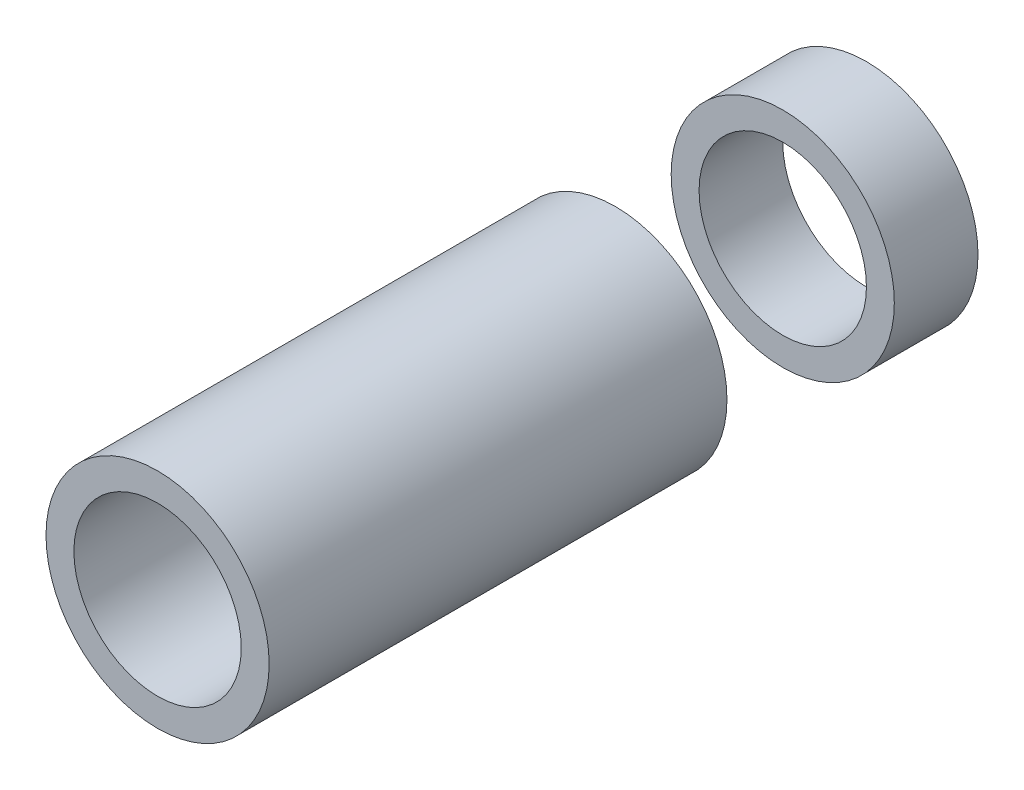
ISO-10303-21;
HEADER;
FILE_DESCRIPTION(('STEP AP214'),'2;1');
FILE_NAME('part.step','',(''),(''),'','','');
FILE_SCHEMA(('AUTOMOTIVE_DESIGN { 1 0 10303 214 1 1 1 1 }'));
ENDSEC;
DATA;
#1=APPLICATION_CONTEXT('core data for automotive mechanical design processes');
#2=APPLICATION_PROTOCOL_DEFINITION('international standard','automotive_design',2000,#1);
#3=PRODUCT_CONTEXT('',#1,'mechanical');
#4=PRODUCT('Part','Part','',(#3));
#5=PRODUCT_RELATED_PRODUCT_CATEGORY('part','',(#4));
#6=PRODUCT_DEFINITION_FORMATION('','',#4);
#7=PRODUCT_DEFINITION_CONTEXT('part definition',#1,'design');
#8=PRODUCT_DEFINITION('design','',#6,#7);
#9=PRODUCT_DEFINITION_SHAPE('','',#8);
#10=(LENGTH_UNIT() NAMED_UNIT(*) SI_UNIT(.MILLI.,.METRE.));
#11=(NAMED_UNIT(*) PLANE_ANGLE_UNIT() SI_UNIT($,.RADIAN.));
#12=(NAMED_UNIT(*) SI_UNIT($,.STERADIAN.) SOLID_ANGLE_UNIT());
#13=UNCERTAINTY_MEASURE_WITH_UNIT(LENGTH_MEASURE(1.E-05),#10,'distance_accuracy_value','');
#14=(GEOMETRIC_REPRESENTATION_CONTEXT(3) GLOBAL_UNCERTAINTY_ASSIGNED_CONTEXT((#13)) GLOBAL_UNIT_ASSIGNED_CONTEXT((#10,
#11,#12)) REPRESENTATION_CONTEXT('',''));
#15=CARTESIAN_POINT('',(0.,0.,0.));
#16=DIRECTION('',(0.,0.,1.));
#17=DIRECTION('',(1.,0.,0.));
#18=AXIS2_PLACEMENT_3D('',#15,#16,#17);
#19=CARTESIAN_POINT('',(0.,6.,-44.82608696));
#20=DIRECTION('',(0.,0.,1.));
#21=DIRECTION('',(1.,0.,0.));
#22=AXIS2_PLACEMENT_3D('',#19,#20,#21);
#23=PLANE('',#22);
#24=CARTESIAN_POINT('',(0.,0.,-44.82608696));
#25=DIRECTION('',(0.,0.,-1.));
#26=DIRECTION('',(-1.,0.,0.));
#27=AXIS2_PLACEMENT_3D('',#24,#25,#26);
#28=CIRCLE('',#27,6.);
#29=CARTESIAN_POINT('',(-6.,0.,-44.82608696));
#30=VERTEX_POINT('',#29);
#31=EDGE_CURVE('E53',#30,#30,#28,.T.);
#32=ORIENTED_EDGE('',*,*,#31,.T.);
#33=EDGE_LOOP('',(#32));
#34=FACE_BOUND('',#33,.T.);
#35=CARTESIAN_POINT('',(0.,0.,-44.82608696));
#36=DIRECTION('',(0.,0.,-1.));
#37=DIRECTION('',(-1.,0.,0.));
#38=AXIS2_PLACEMENT_3D('',#35,#36,#37);
#39=CIRCLE('',#38,8.);
#40=CARTESIAN_POINT('',(-8.,0.,-44.82608696));
#41=VERTEX_POINT('',#40);
#42=EDGE_CURVE('E11',#41,#41,#39,.T.);
#43=ORIENTED_EDGE('',*,*,#42,.F.);
#44=EDGE_LOOP('',(#43));
#45=FACE_BOUND('',#44,.T.);
#46=ADVANCED_FACE('F39',(#34,#45),#23,.T.);
#47=CARTESIAN_POINT('',(0.,0.,-26.3478260869565));
#48=DIRECTION('',(0.,0.,-1.));
#49=DIRECTION('',(-1.,0.,0.));
#50=AXIS2_PLACEMENT_3D('',#47,#48,#49);
#51=CYLINDRICAL_SURFACE('',#50,8.);
#52=ORIENTED_EDGE('',*,*,#42,.T.);
#53=EDGE_LOOP('',(#52));
#54=FACE_BOUND('',#53,.T.);
#55=CARTESIAN_POINT('',(0.,0.,-50.82608696));
#56=DIRECTION('',(0.,0.,-1.));
#57=DIRECTION('',(-1.,0.,0.));
#58=AXIS2_PLACEMENT_3D('',#55,#56,#57);
#59=CIRCLE('',#58,8.);
#60=CARTESIAN_POINT('',(-8.,0.,-50.82608696));
#61=VERTEX_POINT('',#60);
#62=EDGE_CURVE('E45',#61,#61,#59,.T.);
#63=ORIENTED_EDGE('',*,*,#62,.F.);
#64=EDGE_LOOP('',(#63));
#65=FACE_BOUND('',#64,.T.);
#66=ADVANCED_FACE('F69',(#54,#65),#51,.T.);
#67=CARTESIAN_POINT('',(0.,8.,-50.82608696));
#68=DIRECTION('',(0.,0.,-1.));
#69=DIRECTION('',(-1.,0.,0.));
#70=AXIS2_PLACEMENT_3D('',#67,#68,#69);
#71=PLANE('',#70);
#72=ORIENTED_EDGE('',*,*,#62,.T.);
#73=EDGE_LOOP('',(#72));
#74=FACE_BOUND('',#73,.T.);
#75=CARTESIAN_POINT('',(0.,0.,-50.82608696));
#76=DIRECTION('',(0.,0.,-1.));
#77=DIRECTION('',(-1.,0.,0.));
#78=AXIS2_PLACEMENT_3D('',#75,#76,#77);
#79=CIRCLE('',#78,6.);
#80=CARTESIAN_POINT('',(-6.,0.,-50.82608696));
#81=VERTEX_POINT('',#80);
#82=EDGE_CURVE('E49',#81,#81,#79,.T.);
#83=ORIENTED_EDGE('',*,*,#82,.F.);
#84=EDGE_LOOP('',(#83));
#85=FACE_BOUND('',#84,.T.);
#86=ADVANCED_FACE('F63',(#74,#85),#71,.T.);
#87=CARTESIAN_POINT('',(0.,0.,-26.3478260869565));
#88=DIRECTION('',(0.,0.,-1.));
#89=DIRECTION('',(-1.,0.,0.));
#90=AXIS2_PLACEMENT_3D('',#87,#88,#89);
#91=CYLINDRICAL_SURFACE('',#90,6.);
#92=ORIENTED_EDGE('',*,*,#82,.T.);
#93=EDGE_LOOP('',(#92));
#94=FACE_BOUND('',#93,.T.);
#95=ORIENTED_EDGE('',*,*,#31,.F.);
#96=EDGE_LOOP('',(#95));
#97=FACE_BOUND('',#96,.T.);
#98=ADVANCED_FACE('F61',(#94,#97),#91,.F.);
#99=CLOSED_SHELL('',(#46,#66,#86,#98));
#100=MANIFOLD_SOLID_BREP('B2',#99);
#101=CARTESIAN_POINT('',(0.,6.,0.));
#102=DIRECTION('',(0.,0.,1.));
#103=DIRECTION('',(1.,0.,0.));
#104=AXIS2_PLACEMENT_3D('',#101,#102,#103);
#105=PLANE('',#104);
#106=CARTESIAN_POINT('',(0.,0.,0.));
#107=DIRECTION('',(0.,0.,-1.));
#108=DIRECTION('',(-1.,0.,0.));
#109=AXIS2_PLACEMENT_3D('',#106,#107,#108);
#110=CIRCLE('',#109,6.);
#111=CARTESIAN_POINT('',(-6.,0.,0.));
#112=VERTEX_POINT('',#111);
#113=EDGE_CURVE('E115',#112,#112,#110,.T.);
#114=ORIENTED_EDGE('',*,*,#113,.T.);
#115=EDGE_LOOP('',(#114));
#116=FACE_BOUND('',#115,.T.);
#117=CARTESIAN_POINT('',(0.,0.,0.));
#118=DIRECTION('',(0.,0.,-1.));
#119=DIRECTION('',(-1.,0.,0.));
#120=AXIS2_PLACEMENT_3D('',#117,#118,#119);
#121=CIRCLE('',#120,8.);
#122=CARTESIAN_POINT('',(-8.,0.,0.));
#123=VERTEX_POINT('',#122);
#124=EDGE_CURVE('E38',#123,#123,#121,.T.);
#125=ORIENTED_EDGE('',*,*,#124,.F.);
#126=EDGE_LOOP('',(#125));
#127=FACE_BOUND('',#126,.T.);
#128=ADVANCED_FACE('F101',(#116,#127),#105,.T.);
#129=CARTESIAN_POINT('',(0.,0.,-26.3478260869565));
#130=DIRECTION('',(0.,0.,-1.));
#131=DIRECTION('',(-1.,0.,0.));
#132=AXIS2_PLACEMENT_3D('',#129,#130,#131);
#133=CYLINDRICAL_SURFACE('',#132,8.);
#134=ORIENTED_EDGE('',*,*,#124,.T.);
#135=EDGE_LOOP('',(#134));
#136=FACE_BOUND('',#135,.T.);
#137=CARTESIAN_POINT('',(0.,0.,-32.82608696));
#138=DIRECTION('',(0.,0.,-1.));
#139=DIRECTION('',(-1.,0.,0.));
#140=AXIS2_PLACEMENT_3D('',#137,#138,#139);
#141=CIRCLE('',#140,8.);
#142=CARTESIAN_POINT('',(-8.,0.,-32.82608696));
#143=VERTEX_POINT('',#142);
#144=EDGE_CURVE('E107',#143,#143,#141,.T.);
#145=ORIENTED_EDGE('',*,*,#144,.F.);
#146=EDGE_LOOP('',(#145));
#147=FACE_BOUND('',#146,.T.);
#148=ADVANCED_FACE('F131',(#136,#147),#133,.T.);
#149=CARTESIAN_POINT('',(0.,8.,-32.82608696));
#150=DIRECTION('',(0.,0.,-1.));
#151=DIRECTION('',(-1.,0.,0.));
#152=AXIS2_PLACEMENT_3D('',#149,#150,#151);
#153=PLANE('',#152);
#154=ORIENTED_EDGE('',*,*,#144,.T.);
#155=EDGE_LOOP('',(#154));
#156=FACE_BOUND('',#155,.T.);
#157=CARTESIAN_POINT('',(0.,0.,-32.82608696));
#158=DIRECTION('',(0.,0.,-1.));
#159=DIRECTION('',(-1.,0.,0.));
#160=AXIS2_PLACEMENT_3D('',#157,#158,#159);
#161=CIRCLE('',#160,6.);
#162=CARTESIAN_POINT('',(-6.,0.,-32.82608696));
#163=VERTEX_POINT('',#162);
#164=EDGE_CURVE('E111',#163,#163,#161,.T.);
#165=ORIENTED_EDGE('',*,*,#164,.F.);
#166=EDGE_LOOP('',(#165));
#167=FACE_BOUND('',#166,.T.);
#168=ADVANCED_FACE('F125',(#156,#167),#153,.T.);
#169=CARTESIAN_POINT('',(0.,0.,-26.3478260869565));
#170=DIRECTION('',(0.,0.,-1.));
#171=DIRECTION('',(-1.,0.,0.));
#172=AXIS2_PLACEMENT_3D('',#169,#170,#171);
#173=CYLINDRICAL_SURFACE('',#172,6.);
#174=ORIENTED_EDGE('',*,*,#164,.T.);
#175=EDGE_LOOP('',(#174));
#176=FACE_BOUND('',#175,.T.);
#177=ORIENTED_EDGE('',*,*,#113,.F.);
#178=EDGE_LOOP('',(#177));
#179=FACE_BOUND('',#178,.T.);
#180=ADVANCED_FACE('F123',(#176,#179),#173,.F.);
#181=CLOSED_SHELL('',(#128,#148,#168,#180));
#182=MANIFOLD_SOLID_BREP('B6',#181);
#183=ADVANCED_BREP_SHAPE_REPRESENTATION('',(#18,#100,#182),#14);
#184=SHAPE_DEFINITION_REPRESENTATION(#9,#183);
ENDSEC;
END-ISO-10303-21;
